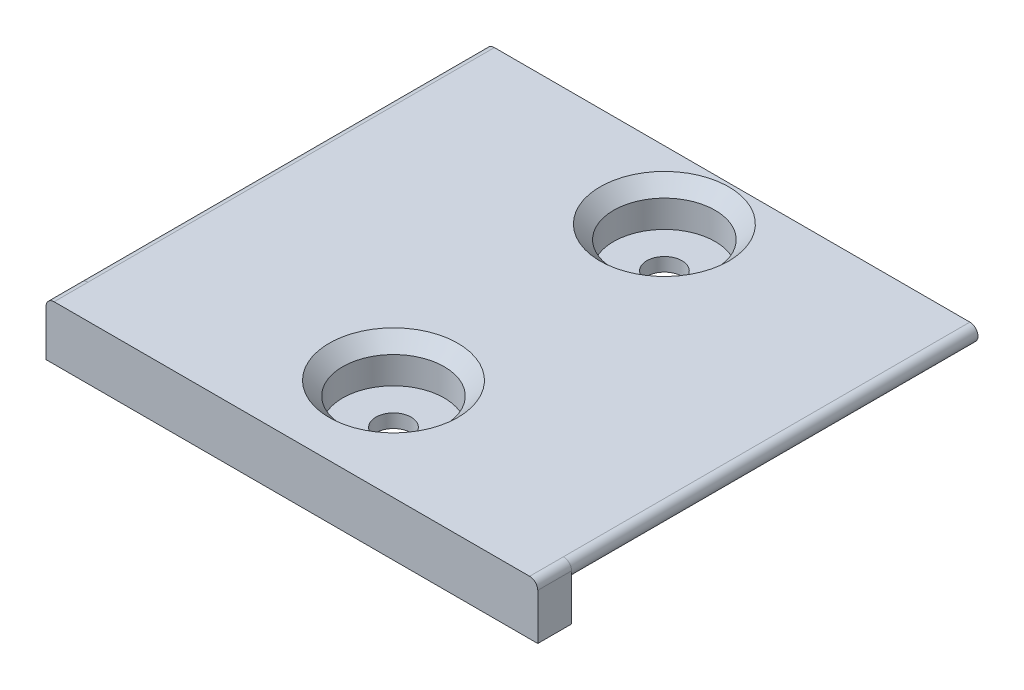
ISO-10303-21;
HEADER;
FILE_DESCRIPTION(('STEP AP214'),'2;1');
FILE_NAME('part.step','',(''),(''),'','','');
FILE_SCHEMA(('AUTOMOTIVE_DESIGN { 1 0 10303 214 1 1 1 1 }'));
ENDSEC;
DATA;
#1=APPLICATION_CONTEXT('core data for automotive mechanical design processes');
#2=APPLICATION_PROTOCOL_DEFINITION('international standard','automotive_design',2000,#1);
#3=PRODUCT_CONTEXT('',#1,'mechanical');
#4=PRODUCT('Part','Part','',(#3));
#5=PRODUCT_RELATED_PRODUCT_CATEGORY('part','',(#4));
#6=PRODUCT_DEFINITION_FORMATION('','',#4);
#7=PRODUCT_DEFINITION_CONTEXT('part definition',#1,'design');
#8=PRODUCT_DEFINITION('design','',#6,#7);
#9=PRODUCT_DEFINITION_SHAPE('','',#8);
#10=(LENGTH_UNIT() NAMED_UNIT(*) SI_UNIT(.MILLI.,.METRE.));
#11=(NAMED_UNIT(*) PLANE_ANGLE_UNIT() SI_UNIT($,.RADIAN.));
#12=(NAMED_UNIT(*) SI_UNIT($,.STERADIAN.) SOLID_ANGLE_UNIT());
#13=UNCERTAINTY_MEASURE_WITH_UNIT(LENGTH_MEASURE(1.E-05),#10,'distance_accuracy_value','');
#14=(GEOMETRIC_REPRESENTATION_CONTEXT(3) GLOBAL_UNCERTAINTY_ASSIGNED_CONTEXT((#13)) GLOBAL_UNIT_ASSIGNED_CONTEXT((#10,
#11,#12)) REPRESENTATION_CONTEXT('',''));
#15=CARTESIAN_POINT('',(0.,0.,0.));
#16=DIRECTION('',(0.,0.,1.));
#17=DIRECTION('',(1.,0.,0.));
#18=AXIS2_PLACEMENT_3D('',#15,#16,#17);
#19=CARTESIAN_POINT('',(0.,-7.35391052434009,50.));
#20=DIRECTION('',(0.,1.,0.));
#21=DIRECTION('',(-1.,0.,0.));
#22=AXIS2_PLACEMENT_3D('',#19,#20,#21);
#23=CYLINDRICAL_SURFACE('',#22,2.6);
#24=CARTESIAN_POINT('',(0.,0.,50.));
#25=DIRECTION('',(0.,1.,0.));
#26=DIRECTION('',(-1.,0.,0.));
#27=AXIS2_PLACEMENT_3D('',#24,#25,#26);
#28=CIRCLE('',#27,2.6);
#29=CARTESIAN_POINT('',(-2.59999999999999,0.,50.));
#30=VERTEX_POINT('',#29);
#31=EDGE_CURVE('E168',#30,#30,#28,.F.);
#32=ORIENTED_EDGE('',*,*,#31,.T.);
#33=EDGE_LOOP('',(#32));
#34=FACE_BOUND('',#33,.T.);
#35=CARTESIAN_POINT('',(0.,2.00000000000001,50.));
#36=DIRECTION('',(0.,1.,0.));
#37=DIRECTION('',(-1.,0.,0.));
#38=AXIS2_PLACEMENT_3D('',#35,#36,#37);
#39=CIRCLE('',#38,2.6);
#40=CARTESIAN_POINT('',(-2.59999999999999,2.,50.));
#41=VERTEX_POINT('',#40);
#42=EDGE_CURVE('E171',#41,#41,#39,.F.);
#43=ORIENTED_EDGE('',*,*,#42,.F.);
#44=EDGE_LOOP('',(#43));
#45=FACE_BOUND('',#44,.T.);
#46=ADVANCED_FACE('F44',(#34,#45),#23,.F.);
#47=CARTESIAN_POINT('',(0.,-7.35391052434009,9.99999999999999));
#48=DIRECTION('',(0.,1.,0.));
#49=DIRECTION('',(-1.,0.,0.));
#50=AXIS2_PLACEMENT_3D('',#47,#48,#49);
#51=CYLINDRICAL_SURFACE('',#50,2.6);
#52=CARTESIAN_POINT('',(0.,0.,9.99999999999999));
#53=DIRECTION('',(0.,1.,0.));
#54=DIRECTION('',(-1.,0.,0.));
#55=AXIS2_PLACEMENT_3D('',#52,#53,#54);
#56=CIRCLE('',#55,2.6);
#57=CARTESIAN_POINT('',(-2.6,0.,9.99999999999999));
#58=VERTEX_POINT('',#57);
#59=EDGE_CURVE('E164',#58,#58,#56,.F.);
#60=ORIENTED_EDGE('',*,*,#59,.T.);
#61=EDGE_LOOP('',(#60));
#62=FACE_BOUND('',#61,.T.);
#63=CARTESIAN_POINT('',(0.,2.00000000000001,9.99999999999999));
#64=DIRECTION('',(0.,1.,0.));
#65=DIRECTION('',(-1.,0.,0.));
#66=AXIS2_PLACEMENT_3D('',#63,#64,#65);
#67=CIRCLE('',#66,2.6);
#68=CARTESIAN_POINT('',(-2.6,2.,9.99999999999999));
#69=VERTEX_POINT('',#68);
#70=EDGE_CURVE('E162',#69,#69,#67,.F.);
#71=ORIENTED_EDGE('',*,*,#70,.F.);
#72=EDGE_LOOP('',(#71));
#73=FACE_BOUND('',#72,.T.);
#74=ADVANCED_FACE('F260',(#62,#73),#51,.F.);
#75=CARTESIAN_POINT('',(30.,0.,60.));
#76=DIRECTION('',(-0.707106781186544,0.707106781186551,0.));
#77=DIRECTION('',(-0.707106781186551,-0.707106781186544,0.));
#78=AXIS2_PLACEMENT_3D('',#75,#76,#77);
#79=PLANE('',#78);
#80=DIRECTION('',(0.707106781186551,0.707106781186544,0.));
#81=VECTOR('',#80,1.);
#82=CARTESIAN_POINT('',(30.,0.,0.));
#83=LINE('',#82,#81);
#84=CARTESIAN_POINT('',(30.,0.,0.));
#85=VERTEX_POINT('',#84);
#86=CARTESIAN_POINT('',(35.9514718625762,5.95147186257614,0.));
#87=VERTEX_POINT('',#86);
#88=EDGE_CURVE('E167',#85,#87,#83,.T.);
#89=ORIENTED_EDGE('',*,*,#88,.T.);
#90=DIRECTION('',(0.,0.,-1.));
#91=VECTOR('',#90,1.);
#92=CARTESIAN_POINT('',(35.9514718625762,5.95147186257614,60.));
#93=LINE('',#92,#91);
#94=CARTESIAN_POINT('',(35.9514718625762,5.95147186257614,60.));
#95=VERTEX_POINT('',#94);
#96=EDGE_CURVE('E216',#87,#95,#93,.F.);
#97=ORIENTED_EDGE('',*,*,#96,.T.);
#98=DIRECTION('',(0.707106781186551,0.707106781186544,0.));
#99=VECTOR('',#98,1.);
#100=CARTESIAN_POINT('',(30.,0.,60.));
#101=LINE('',#100,#99);
#102=CARTESIAN_POINT('',(30.,0.,60.));
#103=VERTEX_POINT('',#102);
#104=EDGE_CURVE('E172',#103,#95,#101,.T.);
#105=ORIENTED_EDGE('',*,*,#104,.F.);
#106=DIRECTION('',(0.,0.,-1.));
#107=VECTOR('',#106,1.);
#108=CARTESIAN_POINT('',(30.,0.,60.));
#109=LINE('',#108,#107);
#110=EDGE_CURVE('E179',#103,#85,#109,.T.);
#111=ORIENTED_EDGE('',*,*,#110,.T.);
#112=EDGE_LOOP('',(#89,#97,#105,#111));
#113=FACE_BOUND('',#112,.T.);
#114=ADVANCED_FACE('F262',(#113),#79,.F.);
#115=CARTESIAN_POINT('',(38.0000000000001,8.00000000000001,60.));
#116=DIRECTION('',(0.,-1.,0.));
#117=DIRECTION('',(1.,0.,0.));
#118=AXIS2_PLACEMENT_3D('',#115,#116,#117);
#119=PLANE('',#118);
#120=CARTESIAN_POINT('',(0.,8.,9.99999999999999));
#121=DIRECTION('',(0.,-1.,0.));
#122=DIRECTION('',(1.,0.,0.));
#123=AXIS2_PLACEMENT_3D('',#120,#121,#122);
#124=CIRCLE('',#123,9.49999999999996);
#125=CARTESIAN_POINT('',(9.49999999999996,8.,9.99999999999999));
#126=VERTEX_POINT('',#125);
#127=EDGE_CURVE('E53',#126,#126,#124,.T.);
#128=ORIENTED_EDGE('',*,*,#127,.T.);
#129=EDGE_LOOP('',(#128));
#130=FACE_BOUND('',#129,.T.);
#131=CARTESIAN_POINT('',(0.,8.,50.));
#132=DIRECTION('',(0.,-1.,0.));
#133=DIRECTION('',(1.,0.,0.));
#134=AXIS2_PLACEMENT_3D('',#131,#132,#133);
#135=CIRCLE('',#134,9.49999999999999);
#136=CARTESIAN_POINT('',(9.5,8.,50.));
#137=VERTEX_POINT('',#136);
#138=EDGE_CURVE('E232',#137,#137,#135,.T.);
#139=ORIENTED_EDGE('',*,*,#138,.T.);
#140=EDGE_LOOP('',(#139));
#141=FACE_BOUND('',#140,.T.);
#142=DIRECTION('',(-1.,0.,0.));
#143=VECTOR('',#142,1.);
#144=CARTESIAN_POINT('',(-36.3029437251523,8.00000000000001,65.));
#145=LINE('',#144,#143);
#146=CARTESIAN_POINT('',(35.1029437251523,8.00000000000001,65.));
#147=VERTEX_POINT('',#146);
#148=CARTESIAN_POINT('',(-35.1029437251523,8.00000000000001,65.));
#149=VERTEX_POINT('',#148);
#150=EDGE_CURVE('E157',#147,#149,#145,.T.);
#151=ORIENTED_EDGE('',*,*,#150,.F.);
#152=DIRECTION('',(0.,0.,-1.));
#153=VECTOR('',#152,1.);
#154=CARTESIAN_POINT('',(35.1029437251523,8.00000000000001,60.));
#155=LINE('',#154,#153);
#156=CARTESIAN_POINT('',(35.1029437251523,8.00000000000001,60.));
#157=VERTEX_POINT('',#156);
#158=EDGE_CURVE('E220',#147,#157,#155,.T.);
#159=ORIENTED_EDGE('',*,*,#158,.T.);
#160=DIRECTION('',(0.,0.,-1.));
#161=VECTOR('',#160,1.);
#162=CARTESIAN_POINT('',(35.1029437251523,8.00000000000001,60.));
#163=LINE('',#162,#161);
#164=CARTESIAN_POINT('',(35.1029437251523,8.00000000000001,0.));
#165=VERTEX_POINT('',#164);
#166=EDGE_CURVE('E204',#157,#165,#163,.T.);
#167=ORIENTED_EDGE('',*,*,#166,.T.);
#168=DIRECTION('',(-1.,0.,0.));
#169=VECTOR('',#168,1.);
#170=CARTESIAN_POINT('',(38.0000000000001,8.00000000000001,0.));
#171=LINE('',#170,#169);
#172=CARTESIAN_POINT('',(-35.1029437251523,7.99999999999999,0.));
#173=VERTEX_POINT('',#172);
#174=EDGE_CURVE('E182',#165,#173,#171,.T.);
#175=ORIENTED_EDGE('',*,*,#174,.T.);
#176=DIRECTION('',(0.,0.,-1.));
#177=VECTOR('',#176,1.);
#178=CARTESIAN_POINT('',(-35.1029437251523,7.99999999999999,60.));
#179=LINE('',#178,#177);
#180=CARTESIAN_POINT('',(-35.1029437251523,7.99999999999999,60.));
#181=VERTEX_POINT('',#180);
#182=EDGE_CURVE('E207',#173,#181,#179,.F.);
#183=ORIENTED_EDGE('',*,*,#182,.T.);
#184=DIRECTION('',(0.,0.,-1.));
#185=VECTOR('',#184,1.);
#186=CARTESIAN_POINT('',(-35.1029437251523,7.99999999999999,60.));
#187=LINE('',#186,#185);
#188=EDGE_CURVE('E218',#181,#149,#187,.F.);
#189=ORIENTED_EDGE('',*,*,#188,.T.);
#190=EDGE_LOOP('',(#151,#159,#167,#175,#183,#189));
#191=FACE_BOUND('',#190,.T.);
#192=ADVANCED_FACE('F237',(#130,#141,#191),#119,.F.);
#193=CARTESIAN_POINT('',(-38.0000000000001,7.99999999999999,60.));
#194=DIRECTION('',(0.707106781186544,0.707106781186551,0.));
#195=DIRECTION('',(-0.707106781186551,0.707106781186544,0.));
#196=AXIS2_PLACEMENT_3D('',#193,#194,#195);
#197=PLANE('',#196);
#198=DIRECTION('',(0.707106781186551,-0.707106781186544,0.));
#199=VECTOR('',#198,1.);
#200=CARTESIAN_POINT('',(-38.0000000000001,7.99999999999999,60.));
#201=LINE('',#200,#199);
#202=CARTESIAN_POINT('',(-35.9514718625762,5.95147186257613,60.));
#203=VERTEX_POINT('',#202);
#204=CARTESIAN_POINT('',(-30.,0.,60.));
#205=VERTEX_POINT('',#204);
#206=EDGE_CURVE('E175',#203,#205,#201,.T.);
#207=ORIENTED_EDGE('',*,*,#206,.F.);
#208=DIRECTION('',(0.,0.,-1.));
#209=VECTOR('',#208,1.);
#210=CARTESIAN_POINT('',(-35.9514718625762,5.95147186257613,60.));
#211=LINE('',#210,#209);
#212=CARTESIAN_POINT('',(-35.9514718625762,5.95147186257613,0.));
#213=VERTEX_POINT('',#212);
#214=EDGE_CURVE('E193',#203,#213,#211,.T.);
#215=ORIENTED_EDGE('',*,*,#214,.T.);
#216=DIRECTION('',(0.707106781186551,-0.707106781186544,0.));
#217=VECTOR('',#216,1.);
#218=CARTESIAN_POINT('',(-38.0000000000001,7.99999999999999,0.));
#219=LINE('',#218,#217);
#220=CARTESIAN_POINT('',(-30.,0.,0.));
#221=VERTEX_POINT('',#220);
#222=EDGE_CURVE('E185',#213,#221,#219,.T.);
#223=ORIENTED_EDGE('',*,*,#222,.T.);
#224=DIRECTION('',(0.,0.,-1.));
#225=VECTOR('',#224,1.);
#226=CARTESIAN_POINT('',(-30.,0.,60.));
#227=LINE('',#226,#225);
#228=EDGE_CURVE('E190',#205,#221,#227,.T.);
#229=ORIENTED_EDGE('',*,*,#228,.F.);
#230=EDGE_LOOP('',(#207,#215,#223,#229));
#231=FACE_BOUND('',#230,.T.);
#232=ADVANCED_FACE('F282',(#231),#197,.F.);
#233=CARTESIAN_POINT('',(-30.,0.,60.));
#234=DIRECTION('',(0.,1.,0.));
#235=DIRECTION('',(-1.,0.,0.));
#236=AXIS2_PLACEMENT_3D('',#233,#234,#235);
#237=PLANE('',#236);
#238=ORIENTED_EDGE('',*,*,#59,.F.);
#239=EDGE_LOOP('',(#238));
#240=FACE_BOUND('',#239,.T.);
#241=ORIENTED_EDGE('',*,*,#31,.F.);
#242=EDGE_LOOP('',(#241));
#243=FACE_BOUND('',#242,.T.);
#244=DIRECTION('',(1.,0.,0.));
#245=VECTOR('',#244,1.);
#246=CARTESIAN_POINT('',(-30.,0.,0.));
#247=LINE('',#246,#245);
#248=EDGE_CURVE('E176',#221,#85,#247,.T.);
#249=ORIENTED_EDGE('',*,*,#248,.T.);
#250=ORIENTED_EDGE('',*,*,#110,.F.);
#251=DIRECTION('',(1.,0.,0.));
#252=VECTOR('',#251,1.);
#253=CARTESIAN_POINT('',(-36.3029437251523,0.,60.));
#254=LINE('',#253,#252);
#255=CARTESIAN_POINT('',(36.3029437251523,0.,60.));
#256=VERTEX_POINT('',#255);
#257=EDGE_CURVE('E319',#103,#256,#254,.T.);
#258=ORIENTED_EDGE('',*,*,#257,.T.);
#259=DIRECTION('',(0.,0.,-1.));
#260=VECTOR('',#259,1.);
#261=CARTESIAN_POINT('',(36.3029437251523,0.,65.));
#262=LINE('',#261,#260);
#263=CARTESIAN_POINT('',(36.3029437251523,0.,65.));
#264=VERTEX_POINT('',#263);
#265=EDGE_CURVE('E145',#264,#256,#262,.T.);
#266=ORIENTED_EDGE('',*,*,#265,.F.);
#267=DIRECTION('',(1.,0.,0.));
#268=VECTOR('',#267,1.);
#269=CARTESIAN_POINT('',(-36.3029437251523,0.,65.));
#270=LINE('',#269,#268);
#271=CARTESIAN_POINT('',(-36.3029437251523,0.,65.));
#272=VERTEX_POINT('',#271);
#273=EDGE_CURVE('E131',#272,#264,#270,.T.);
#274=ORIENTED_EDGE('',*,*,#273,.F.);
#275=DIRECTION('',(0.,0.,-1.));
#276=VECTOR('',#275,1.);
#277=CARTESIAN_POINT('',(-36.3029437251523,0.,65.));
#278=LINE('',#277,#276);
#279=CARTESIAN_POINT('',(-36.3029437251523,0.,60.));
#280=VERTEX_POINT('',#279);
#281=EDGE_CURVE('E143',#272,#280,#278,.T.);
#282=ORIENTED_EDGE('',*,*,#281,.T.);
#283=EDGE_CURVE('E318',#280,#205,#254,.T.);
#284=ORIENTED_EDGE('',*,*,#283,.T.);
#285=ORIENTED_EDGE('',*,*,#228,.T.);
#286=EDGE_LOOP('',(#249,#250,#258,#266,#274,#282,#284,#285));
#287=FACE_BOUND('',#286,.T.);
#288=ADVANCED_FACE('F141',(#240,#243,#287),#237,.F.);
#289=CARTESIAN_POINT('',(0.,0.,0.));
#290=DIRECTION('',(0.,0.,-1.));
#291=DIRECTION('',(-1.,0.,0.));
#292=AXIS2_PLACEMENT_3D('',#289,#290,#291);
#293=PLANE('',#292);
#294=ORIENTED_EDGE('',*,*,#222,.F.);
#295=CARTESIAN_POINT('',(-35.1029437251523,6.79999999999999,0.));
#296=DIRECTION('',(0.,0.,-1.));
#297=DIRECTION('',(-1.,0.,0.));
#298=AXIS2_PLACEMENT_3D('',#295,#296,#297);
#299=CIRCLE('',#298,1.2);
#300=EDGE_CURVE('E202',#213,#173,#299,.T.);
#301=ORIENTED_EDGE('',*,*,#300,.T.);
#302=ORIENTED_EDGE('',*,*,#174,.F.);
#303=CARTESIAN_POINT('',(35.1029437251523,6.80000000000001,0.));
#304=DIRECTION('',(0.,0.,-1.));
#305=DIRECTION('',(-1.,0.,0.));
#306=AXIS2_PLACEMENT_3D('',#303,#304,#305);
#307=CIRCLE('',#306,1.2);
#308=EDGE_CURVE('E200',#165,#87,#307,.T.);
#309=ORIENTED_EDGE('',*,*,#308,.T.);
#310=ORIENTED_EDGE('',*,*,#88,.F.);
#311=ORIENTED_EDGE('',*,*,#248,.F.);
#312=EDGE_LOOP('',(#294,#301,#302,#309,#310,#311));
#313=FACE_BOUND('',#312,.T.);
#314=ADVANCED_FACE('F256',(#313),#293,.T.);
#315=CARTESIAN_POINT('',(-30.,2.,60.));
#316=DIRECTION('',(0.,1.,0.));
#317=DIRECTION('',(-1.,0.,0.));
#318=AXIS2_PLACEMENT_3D('',#315,#316,#317);
#319=PLANE('',#318);
#320=CARTESIAN_POINT('',(0.,2.00000000000001,9.99999999999999));
#321=DIRECTION('',(0.,1.,0.));
#322=DIRECTION('',(-1.,0.,0.));
#323=AXIS2_PLACEMENT_3D('',#320,#321,#322);
#324=CIRCLE('',#323,7.5);
#325=CARTESIAN_POINT('',(-7.5,2.00000000000001,9.99999999999999));
#326=VERTEX_POINT('',#325);
#327=EDGE_CURVE('E155',#326,#326,#324,.F.);
#328=ORIENTED_EDGE('',*,*,#327,.F.);
#329=EDGE_LOOP('',(#328));
#330=FACE_BOUND('',#329,.T.);
#331=ORIENTED_EDGE('',*,*,#70,.T.);
#332=EDGE_LOOP('',(#331));
#333=FACE_BOUND('',#332,.T.);
#334=ADVANCED_FACE('F250',(#330,#333),#319,.T.);
#335=CARTESIAN_POINT('',(0.,-21.2132034355964,9.99999999999999));
#336=DIRECTION('',(0.,1.,0.));
#337=DIRECTION('',(-1.,0.,0.));
#338=AXIS2_PLACEMENT_3D('',#335,#336,#337);
#339=CYLINDRICAL_SURFACE('',#338,7.5);
#340=CARTESIAN_POINT('',(0.,6.00000000000005,9.99999999999999));
#341=DIRECTION('',(0.,-1.,0.));
#342=DIRECTION('',(1.,0.,0.));
#343=AXIS2_PLACEMENT_3D('',#340,#341,#342);
#344=CIRCLE('',#343,7.5);
#345=CARTESIAN_POINT('',(7.5,6.00000000000005,9.99999999999999));
#346=VERTEX_POINT('',#345);
#347=EDGE_CURVE('E229',#346,#346,#344,.F.);
#348=ORIENTED_EDGE('',*,*,#347,.T.);
#349=EDGE_LOOP('',(#348));
#350=FACE_BOUND('',#349,.T.);
#351=ORIENTED_EDGE('',*,*,#327,.T.);
#352=EDGE_LOOP('',(#351));
#353=FACE_BOUND('',#352,.T.);
#354=ADVANCED_FACE('F246',(#350,#353),#339,.F.);
#355=CARTESIAN_POINT('',(-30.,2.,60.));
#356=DIRECTION('',(0.,1.,0.));
#357=DIRECTION('',(-1.,0.,0.));
#358=AXIS2_PLACEMENT_3D('',#355,#356,#357);
#359=PLANE('',#358);
#360=CARTESIAN_POINT('',(0.,2.00000000000001,50.));
#361=DIRECTION('',(0.,1.,0.));
#362=DIRECTION('',(-1.,0.,0.));
#363=AXIS2_PLACEMENT_3D('',#360,#361,#362);
#364=CIRCLE('',#363,7.5);
#365=CARTESIAN_POINT('',(-7.49999999999999,2.00000000000001,50.));
#366=VERTEX_POINT('',#365);
#367=EDGE_CURVE('E152',#366,#366,#364,.F.);
#368=ORIENTED_EDGE('',*,*,#367,.F.);
#369=EDGE_LOOP('',(#368));
#370=FACE_BOUND('',#369,.T.);
#371=ORIENTED_EDGE('',*,*,#42,.T.);
#372=EDGE_LOOP('',(#371));
#373=FACE_BOUND('',#372,.T.);
#374=ADVANCED_FACE('F249',(#370,#373),#359,.T.);
#375=CARTESIAN_POINT('',(0.,-21.2132034355964,50.));
#376=DIRECTION('',(0.,1.,0.));
#377=DIRECTION('',(-1.,0.,0.));
#378=AXIS2_PLACEMENT_3D('',#375,#376,#377);
#379=CYLINDRICAL_SURFACE('',#378,7.5);
#380=CARTESIAN_POINT('',(0.,6.00000000000001,50.));
#381=DIRECTION('',(0.,-1.,0.));
#382=DIRECTION('',(1.,0.,0.));
#383=AXIS2_PLACEMENT_3D('',#380,#381,#382);
#384=CIRCLE('',#383,7.5);
#385=CARTESIAN_POINT('',(7.50000000000001,6.00000000000001,50.));
#386=VERTEX_POINT('',#385);
#387=EDGE_CURVE('E12',#386,#386,#384,.F.);
#388=ORIENTED_EDGE('',*,*,#387,.T.);
#389=EDGE_LOOP('',(#388));
#390=FACE_BOUND('',#389,.T.);
#391=ORIENTED_EDGE('',*,*,#367,.T.);
#392=EDGE_LOOP('',(#391));
#393=FACE_BOUND('',#392,.T.);
#394=ADVANCED_FACE('F274',(#390,#393),#379,.F.);
#395=CARTESIAN_POINT('',(-35.1029437251523,6.79999999999999,60.));
#396=DIRECTION('',(0.,0.,-1.));
#397=DIRECTION('',(-1.,0.,0.));
#398=AXIS2_PLACEMENT_3D('',#395,#396,#397);
#399=CYLINDRICAL_SURFACE('',#398,1.2);
#400=CARTESIAN_POINT('',(-35.1029437251523,6.79999999999999,60.));
#401=DIRECTION('',(0.,0.,-1.));
#402=DIRECTION('',(-1.,0.,0.));
#403=AXIS2_PLACEMENT_3D('',#400,#401,#402);
#404=CIRCLE('',#403,1.2);
#405=CARTESIAN_POINT('',(-36.3029437251523,6.79999999999999,60.));
#406=VERTEX_POINT('',#405);
#407=EDGE_CURVE('E214',#181,#406,#404,.F.);
#408=ORIENTED_EDGE('',*,*,#407,.F.);
#409=ORIENTED_EDGE('',*,*,#182,.F.);
#410=ORIENTED_EDGE('',*,*,#300,.F.);
#411=ORIENTED_EDGE('',*,*,#214,.F.);
#412=EDGE_CURVE('E213',#406,#203,#404,.F.);
#413=ORIENTED_EDGE('',*,*,#412,.F.);
#414=EDGE_LOOP('',(#408,#409,#410,#411,#413));
#415=FACE_BOUND('',#414,.T.);
#416=ADVANCED_FACE('F289',(#415),#399,.T.);
#417=CARTESIAN_POINT('',(35.1029437251523,6.80000000000001,60.));
#418=DIRECTION('',(0.,0.,-1.));
#419=DIRECTION('',(-1.,0.,0.));
#420=AXIS2_PLACEMENT_3D('',#417,#418,#419);
#421=CYLINDRICAL_SURFACE('',#420,1.2);
#422=CARTESIAN_POINT('',(35.1029437251523,6.80000000000001,60.));
#423=DIRECTION('',(0.,0.,-1.));
#424=DIRECTION('',(-1.,0.,0.));
#425=AXIS2_PLACEMENT_3D('',#422,#423,#424);
#426=CIRCLE('',#425,1.2);
#427=CARTESIAN_POINT('',(36.3029437251523,6.80000000000001,60.));
#428=VERTEX_POINT('',#427);
#429=EDGE_CURVE('E210',#95,#428,#426,.F.);
#430=ORIENTED_EDGE('',*,*,#429,.F.);
#431=ORIENTED_EDGE('',*,*,#96,.F.);
#432=ORIENTED_EDGE('',*,*,#308,.F.);
#433=ORIENTED_EDGE('',*,*,#166,.F.);
#434=EDGE_CURVE('E209',#428,#157,#426,.F.);
#435=ORIENTED_EDGE('',*,*,#434,.F.);
#436=EDGE_LOOP('',(#430,#431,#432,#433,#435));
#437=FACE_BOUND('',#436,.T.);
#438=ADVANCED_FACE('F292',(#437),#421,.T.);
#439=CARTESIAN_POINT('',(0.,0.,60.));
#440=DIRECTION('',(0.,0.,1.));
#441=DIRECTION('',(1.,0.,0.));
#442=AXIS2_PLACEMENT_3D('',#439,#440,#441);
#443=PLANE('',#442);
#444=DIRECTION('',(0.,-1.,0.));
#445=VECTOR('',#444,1.);
#446=CARTESIAN_POINT('',(-36.3029437251523,8.00000000000001,60.));
#447=LINE('',#446,#445);
#448=EDGE_CURVE('E150',#406,#280,#447,.T.);
#449=ORIENTED_EDGE('',*,*,#448,.F.);
#450=ORIENTED_EDGE('',*,*,#412,.T.);
#451=ORIENTED_EDGE('',*,*,#206,.T.);
#452=ORIENTED_EDGE('',*,*,#283,.F.);
#453=EDGE_LOOP('',(#449,#450,#451,#452));
#454=FACE_BOUND('',#453,.T.);
#455=ADVANCED_FACE('F296',(#454),#443,.F.);
#456=ORIENTED_EDGE('',*,*,#257,.F.);
#457=ORIENTED_EDGE('',*,*,#104,.T.);
#458=ORIENTED_EDGE('',*,*,#429,.T.);
#459=DIRECTION('',(0.,1.,0.));
#460=VECTOR('',#459,1.);
#461=CARTESIAN_POINT('',(36.3029437251523,8.00000000000001,60.));
#462=LINE('',#461,#460);
#463=EDGE_CURVE('E137',#256,#428,#462,.T.);
#464=ORIENTED_EDGE('',*,*,#463,.F.);
#465=EDGE_LOOP('',(#456,#457,#458,#464));
#466=FACE_BOUND('',#465,.T.);
#467=ADVANCED_FACE('F340',(#466),#443,.F.);
#468=CARTESIAN_POINT('',(-36.3029437251523,8.00000000000001,65.));
#469=DIRECTION('',(1.,0.,0.));
#470=DIRECTION('',(0.,0.,-1.));
#471=AXIS2_PLACEMENT_3D('',#468,#469,#470);
#472=PLANE('',#471);
#473=DIRECTION('',(0.,-1.,0.));
#474=VECTOR('',#473,1.);
#475=CARTESIAN_POINT('',(-36.3029437251523,8.00000000000001,65.));
#476=LINE('',#475,#474);
#477=CARTESIAN_POINT('',(-36.3029437251523,6.79999999999999,65.));
#478=VERTEX_POINT('',#477);
#479=EDGE_CURVE('E128',#478,#272,#476,.T.);
#480=ORIENTED_EDGE('',*,*,#479,.F.);
#481=DIRECTION('',(0.,0.,-1.));
#482=VECTOR('',#481,1.);
#483=CARTESIAN_POINT('',(-36.3029437251523,6.79999999999999,65.));
#484=LINE('',#483,#482);
#485=EDGE_CURVE('E227',#478,#406,#484,.T.);
#486=ORIENTED_EDGE('',*,*,#485,.T.);
#487=ORIENTED_EDGE('',*,*,#448,.T.);
#488=ORIENTED_EDGE('',*,*,#281,.F.);
#489=EDGE_LOOP('',(#480,#486,#487,#488));
#490=FACE_BOUND('',#489,.T.);
#491=ADVANCED_FACE('F148',(#490),#472,.F.);
#492=CARTESIAN_POINT('',(36.3029437251523,8.00000000000001,65.));
#493=DIRECTION('',(-1.,0.,0.));
#494=DIRECTION('',(0.,0.,1.));
#495=AXIS2_PLACEMENT_3D('',#492,#493,#494);
#496=PLANE('',#495);
#497=ORIENTED_EDGE('',*,*,#463,.T.);
#498=DIRECTION('',(0.,0.,-1.));
#499=VECTOR('',#498,1.);
#500=CARTESIAN_POINT('',(36.3029437251523,6.80000000000001,65.));
#501=LINE('',#500,#499);
#502=CARTESIAN_POINT('',(36.3029437251523,6.80000000000001,65.));
#503=VERTEX_POINT('',#502);
#504=EDGE_CURVE('E68',#428,#503,#501,.F.);
#505=ORIENTED_EDGE('',*,*,#504,.T.);
#506=DIRECTION('',(0.,1.,0.));
#507=VECTOR('',#506,1.);
#508=CARTESIAN_POINT('',(36.3029437251523,8.00000000000001,65.));
#509=LINE('',#508,#507);
#510=EDGE_CURVE('E146',#264,#503,#509,.T.);
#511=ORIENTED_EDGE('',*,*,#510,.F.);
#512=ORIENTED_EDGE('',*,*,#265,.T.);
#513=EDGE_LOOP('',(#497,#505,#511,#512));
#514=FACE_BOUND('',#513,.T.);
#515=ADVANCED_FACE('F325',(#514),#496,.F.);
#516=CARTESIAN_POINT('',(0.,0.,65.));
#517=DIRECTION('',(0.,0.,1.));
#518=DIRECTION('',(1.,0.,0.));
#519=AXIS2_PLACEMENT_3D('',#516,#517,#518);
#520=PLANE('',#519);
#521=ORIENTED_EDGE('',*,*,#510,.T.);
#522=CARTESIAN_POINT('',(35.1029437251523,6.80000000000001,65.));
#523=DIRECTION('',(0.,0.,1.));
#524=DIRECTION('',(1.,0.,0.));
#525=AXIS2_PLACEMENT_3D('',#522,#523,#524);
#526=CIRCLE('',#525,1.2);
#527=EDGE_CURVE('E225',#503,#147,#526,.T.);
#528=ORIENTED_EDGE('',*,*,#527,.T.);
#529=ORIENTED_EDGE('',*,*,#150,.T.);
#530=CARTESIAN_POINT('',(-35.1029437251523,6.79999999999999,65.));
#531=DIRECTION('',(0.,0.,1.));
#532=DIRECTION('',(1.,0.,0.));
#533=AXIS2_PLACEMENT_3D('',#530,#531,#532);
#534=CIRCLE('',#533,1.2);
#535=EDGE_CURVE('E60',#149,#478,#534,.T.);
#536=ORIENTED_EDGE('',*,*,#535,.T.);
#537=ORIENTED_EDGE('',*,*,#479,.T.);
#538=ORIENTED_EDGE('',*,*,#273,.T.);
#539=EDGE_LOOP('',(#521,#528,#529,#536,#537,#538));
#540=FACE_BOUND('',#539,.T.);
#541=ADVANCED_FACE('F130',(#540),#520,.T.);
#542=CARTESIAN_POINT('',(35.1029437251523,6.80000000000001,60.));
#543=DIRECTION('',(0.,0.,-1.));
#544=DIRECTION('',(-1.,0.,0.));
#545=AXIS2_PLACEMENT_3D('',#542,#543,#544);
#546=CYLINDRICAL_SURFACE('',#545,1.2);
#547=ORIENTED_EDGE('',*,*,#527,.F.);
#548=ORIENTED_EDGE('',*,*,#504,.F.);
#549=ORIENTED_EDGE('',*,*,#434,.T.);
#550=ORIENTED_EDGE('',*,*,#158,.F.);
#551=EDGE_LOOP('',(#547,#548,#549,#550));
#552=FACE_BOUND('',#551,.T.);
#553=ADVANCED_FACE('F298',(#552),#546,.T.);
#554=CARTESIAN_POINT('',(-35.1029437251523,6.79999999999999,65.));
#555=DIRECTION('',(0.,0.,-1.));
#556=DIRECTION('',(-1.,0.,0.));
#557=AXIS2_PLACEMENT_3D('',#554,#555,#556);
#558=CYLINDRICAL_SURFACE('',#557,1.2);
#559=ORIENTED_EDGE('',*,*,#535,.F.);
#560=ORIENTED_EDGE('',*,*,#188,.F.);
#561=ORIENTED_EDGE('',*,*,#407,.T.);
#562=ORIENTED_EDGE('',*,*,#485,.F.);
#563=EDGE_LOOP('',(#559,#560,#561,#562));
#564=FACE_BOUND('',#563,.T.);
#565=ADVANCED_FACE('F243',(#564),#558,.T.);
#566=CARTESIAN_POINT('',(0.,6.00000000000005,9.99999999999999));
#567=DIRECTION('',(0.,1.,0.));
#568=DIRECTION('',(-1.,0.,0.));
#569=AXIS2_PLACEMENT_3D('',#566,#567,#568);
#570=CONICAL_SURFACE('',#569,7.5,0.785398163397452);
#571=ORIENTED_EDGE('',*,*,#127,.F.);
#572=EDGE_LOOP('',(#571));
#573=FACE_BOUND('',#572,.T.);
#574=ORIENTED_EDGE('',*,*,#347,.F.);
#575=EDGE_LOOP('',(#574));
#576=FACE_BOUND('',#575,.T.);
#577=ADVANCED_FACE('F240',(#573,#576),#570,.F.);
#578=CARTESIAN_POINT('',(0.,6.00000000000001,50.));
#579=DIRECTION('',(0.,1.,0.));
#580=DIRECTION('',(-1.,0.,0.));
#581=AXIS2_PLACEMENT_3D('',#578,#579,#580);
#582=CONICAL_SURFACE('',#581,7.5,0.785398163397448);
#583=ORIENTED_EDGE('',*,*,#138,.F.);
#584=EDGE_LOOP('',(#583));
#585=FACE_BOUND('',#584,.T.);
#586=ORIENTED_EDGE('',*,*,#387,.F.);
#587=EDGE_LOOP('',(#586));
#588=FACE_BOUND('',#587,.T.);
#589=ADVANCED_FACE('F47',(#585,#588),#582,.F.);
#590=CLOSED_SHELL('',(#46,#74,#114,#192,#232,#288,#314,#334,#354,#374,#394,#416,#438,#455,#467,
#491,#515,#541,#553,#565,#577,#589));
#591=MANIFOLD_SOLID_BREP('B2',#590);
#592=ADVANCED_BREP_SHAPE_REPRESENTATION('',(#18,#591),#14);
#593=SHAPE_DEFINITION_REPRESENTATION(#9,#592);
ENDSEC;
END-ISO-10303-21;
